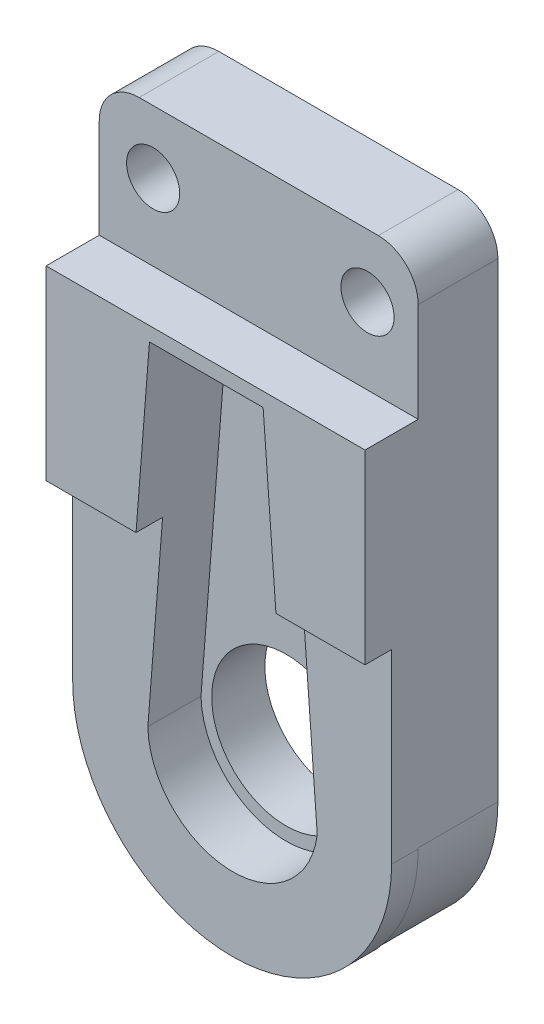
ISO-10303-21;
HEADER;
FILE_DESCRIPTION(('STEP AP214'),'2;1');
FILE_NAME('part.step','',(''),(''),'','','');
FILE_SCHEMA(('AUTOMOTIVE_DESIGN { 1 0 10303 214 1 1 1 1 }'));
ENDSEC;
DATA;
#1=APPLICATION_CONTEXT('core data for automotive mechanical design processes');
#2=APPLICATION_PROTOCOL_DEFINITION('international standard','automotive_design',2000,#1);
#3=PRODUCT_CONTEXT('',#1,'mechanical');
#4=PRODUCT('Part','Part','',(#3));
#5=PRODUCT_RELATED_PRODUCT_CATEGORY('part','',(#4));
#6=PRODUCT_DEFINITION_FORMATION('','',#4);
#7=PRODUCT_DEFINITION_CONTEXT('part definition',#1,'design');
#8=PRODUCT_DEFINITION('design','',#6,#7);
#9=PRODUCT_DEFINITION_SHAPE('','',#8);
#10=(LENGTH_UNIT() NAMED_UNIT(*) SI_UNIT(.MILLI.,.METRE.));
#11=(NAMED_UNIT(*) PLANE_ANGLE_UNIT() SI_UNIT($,.RADIAN.));
#12=(NAMED_UNIT(*) SI_UNIT($,.STERADIAN.) SOLID_ANGLE_UNIT());
#13=UNCERTAINTY_MEASURE_WITH_UNIT(LENGTH_MEASURE(1.E-05),#10,'distance_accuracy_value','');
#14=(GEOMETRIC_REPRESENTATION_CONTEXT(3) GLOBAL_UNCERTAINTY_ASSIGNED_CONTEXT((#13)) GLOBAL_UNIT_ASSIGNED_CONTEXT((#10,
#11,#12)) REPRESENTATION_CONTEXT('',''));
#15=CARTESIAN_POINT('',(0.,0.,0.));
#16=DIRECTION('',(0.,0.,1.));
#17=DIRECTION('',(1.,0.,0.));
#18=AXIS2_PLACEMENT_3D('',#15,#16,#17);
#19=CARTESIAN_POINT('',(-54.0277041312551,91.0179982473059,10.));
#20=DIRECTION('',(0.,0.,-1.));
#21=DIRECTION('',(-1.,0.,0.));
#22=AXIS2_PLACEMENT_3D('',#19,#20,#21);
#23=CYLINDRICAL_SURFACE('',#22,6.);
#24=DIRECTION('',(0.,0.,-1.));
#25=VECTOR('',#24,1.);
#26=CARTESIAN_POINT('',(-54.0277041312551,85.0179982473059,10.));
#27=LINE('',#26,#25);
#28=CARTESIAN_POINT('',(-54.0277041312551,85.0179982473059,9.));
#29=VERTEX_POINT('',#28);
#30=CARTESIAN_POINT('',(-54.0277041312551,85.0179982473059,8.));
#31=VERTEX_POINT('',#30);
#32=EDGE_CURVE('E281',#29,#31,#27,.T.);
#33=ORIENTED_EDGE('',*,*,#32,.F.);
#34=CARTESIAN_POINT('',(-54.0277041312551,91.0179982473059,9.));
#35=DIRECTION('',(0.,0.,1.));
#36=DIRECTION('',(1.,0.,0.));
#37=AXIS2_PLACEMENT_3D('',#34,#35,#36);
#38=CIRCLE('',#37,6.);
#39=CARTESIAN_POINT('',(-60.0277041312551,91.0179982473059,9.));
#40=VERTEX_POINT('',#39);
#41=EDGE_CURVE('E223',#29,#40,#38,.F.);
#42=ORIENTED_EDGE('',*,*,#41,.T.);
#43=DIRECTION('',(0.,0.,-1.));
#44=VECTOR('',#43,1.);
#45=CARTESIAN_POINT('',(-60.0277041312551,91.0179982473059,8.));
#46=LINE('',#45,#44);
#47=CARTESIAN_POINT('',(-60.0277041312551,91.0179982473059,8.));
#48=VERTEX_POINT('',#47);
#49=EDGE_CURVE('E207',#48,#40,#46,.F.);
#50=ORIENTED_EDGE('',*,*,#49,.F.);
#51=CARTESIAN_POINT('',(-54.0277041312551,91.0179982473059,8.));
#52=DIRECTION('',(0.,0.,1.));
#53=DIRECTION('',(1.,0.,0.));
#54=AXIS2_PLACEMENT_3D('',#51,#52,#53);
#55=CIRCLE('',#54,6.);
#56=EDGE_CURVE('E367',#31,#48,#55,.F.);
#57=ORIENTED_EDGE('',*,*,#56,.F.);
#58=EDGE_LOOP('',(#33,#42,#50,#57));
#59=FACE_BOUND('',#58,.T.);
#60=ADVANCED_FACE('F39',(#59),#23,.T.);
#61=CARTESIAN_POINT('',(-54.0277041312551,91.0179982473059,8.));
#62=DIRECTION('',(0.,0.,-1.));
#63=DIRECTION('',(-1.,0.,0.));
#64=AXIS2_PLACEMENT_3D('',#61,#62,#63);
#65=CYLINDRICAL_SURFACE('',#64,6.);
#66=DIRECTION('',(0.,0.,-1.));
#67=VECTOR('',#66,1.);
#68=CARTESIAN_POINT('',(-48.0277041312551,91.0179982473059,8.));
#69=LINE('',#68,#67);
#70=CARTESIAN_POINT('',(-48.0277041312551,91.0179982473059,9.));
#71=VERTEX_POINT('',#70);
#72=CARTESIAN_POINT('',(-48.0277041312551,91.0179982473059,8.));
#73=VERTEX_POINT('',#72);
#74=EDGE_CURVE('E361',#71,#73,#69,.T.);
#75=ORIENTED_EDGE('',*,*,#74,.F.);
#76=CARTESIAN_POINT('',(-54.0277041312551,91.0179982473059,9.));
#77=DIRECTION('',(0.,0.,1.));
#78=DIRECTION('',(1.,0.,0.));
#79=AXIS2_PLACEMENT_3D('',#76,#77,#78);
#80=CIRCLE('',#79,6.);
#81=EDGE_CURVE('E219',#71,#29,#80,.F.);
#82=ORIENTED_EDGE('',*,*,#81,.T.);
#83=ORIENTED_EDGE('',*,*,#32,.T.);
#84=CARTESIAN_POINT('',(-54.0277041312551,91.0179982473059,8.));
#85=DIRECTION('',(0.,0.,1.));
#86=DIRECTION('',(1.,0.,0.));
#87=AXIS2_PLACEMENT_3D('',#84,#85,#86);
#88=CIRCLE('',#87,6.);
#89=EDGE_CURVE('E370',#73,#31,#88,.F.);
#90=ORIENTED_EDGE('',*,*,#89,.F.);
#91=EDGE_LOOP('',(#75,#82,#83,#90));
#92=FACE_BOUND('',#91,.T.);
#93=ADVANCED_FACE('F450',(#92),#65,.T.);
#94=CARTESIAN_POINT('',(-54.0000006238961,90.985353999353,7.));
#95=DIRECTION('',(0.,0.,1.));
#96=DIRECTION('',(1.,0.,0.));
#97=AXIS2_PLACEMENT_3D('',#94,#95,#96);
#98=CYLINDRICAL_SURFACE('',#97,3.19999938509519);
#99=CARTESIAN_POINT('',(-54.0000006238961,90.985353999353,9.));
#100=DIRECTION('',(0.,0.,1.));
#101=DIRECTION('',(1.,0.,0.));
#102=AXIS2_PLACEMENT_3D('',#99,#100,#101);
#103=CIRCLE('',#102,3.19999938509519);
#104=CARTESIAN_POINT('',(-50.8248977661133,90.5869598388672,9.));
#105=VERTEX_POINT('',#104);
#106=CARTESIAN_POINT('',(-57.1992263793945,90.9149932861328,9.));
#107=VERTEX_POINT('',#106);
#108=EDGE_CURVE('E388',#105,#107,#103,.F.);
#109=ORIENTED_EDGE('',*,*,#108,.F.);
#110=DIRECTION('',(0.,0.,1.));
#111=VECTOR('',#110,1.);
#112=CARTESIAN_POINT('',(-50.8248977661133,90.5869598388672,7.));
#113=LINE('',#112,#111);
#114=CARTESIAN_POINT('',(-50.8248977661133,90.5869598388672,7.));
#115=VERTEX_POINT('',#114);
#116=EDGE_CURVE('E286',#115,#105,#113,.T.);
#117=ORIENTED_EDGE('',*,*,#116,.F.);
#118=CARTESIAN_POINT('',(-54.0000006238961,90.985353999353,7.));
#119=DIRECTION('',(0.,0.,1.));
#120=DIRECTION('',(1.,0.,0.));
#121=AXIS2_PLACEMENT_3D('',#118,#119,#120);
#122=CIRCLE('',#121,3.19999938509519);
#123=CARTESIAN_POINT('',(-57.1992263793945,90.9149932861328,7.));
#124=VERTEX_POINT('',#123);
#125=EDGE_CURVE('E264',#124,#115,#122,.T.);
#126=ORIENTED_EDGE('',*,*,#125,.F.);
#127=DIRECTION('',(0.,0.,1.));
#128=VECTOR('',#127,1.);
#129=CARTESIAN_POINT('',(-57.1992263793945,90.9149932861328,7.));
#130=LINE('',#129,#128);
#131=EDGE_CURVE('E276',#124,#107,#130,.T.);
#132=ORIENTED_EDGE('',*,*,#131,.T.);
#133=EDGE_LOOP('',(#109,#117,#126,#132));
#134=FACE_BOUND('',#133,.T.);
#135=ADVANCED_FACE('F479',(#134),#98,.F.);
#136=CARTESIAN_POINT('',(-60.0277041312551,110.255662644268,8.));
#137=DIRECTION('',(1.,0.,0.));
#138=DIRECTION('',(0.,0.,-1.));
#139=AXIS2_PLACEMENT_3D('',#136,#137,#138);
#140=PLANE('',#139);
#141=DIRECTION('',(0.,-1.,0.));
#142=VECTOR('',#141,1.);
#143=CARTESIAN_POINT('',(-60.0277041312551,110.255662644268,8.));
#144=LINE('',#143,#142);
#145=CARTESIAN_POINT('',(-60.0277041312551,108.755662644268,8.));
#146=VERTEX_POINT('',#145);
#147=CARTESIAN_POINT('',(-60.0277041312551,105.017998247306,8.));
#148=VERTEX_POINT('',#147);
#149=EDGE_CURVE('E321',#146,#148,#144,.T.);
#150=ORIENTED_EDGE('',*,*,#149,.F.);
#151=DIRECTION('',(0.,0.,-1.));
#152=VECTOR('',#151,1.);
#153=CARTESIAN_POINT('',(-60.0277041312551,108.755662644268,8.));
#154=LINE('',#153,#152);
#155=CARTESIAN_POINT('',(-60.0277041312551,108.755662644268,5.));
#156=VERTEX_POINT('',#155);
#157=EDGE_CURVE('E395',#146,#156,#154,.T.);
#158=ORIENTED_EDGE('',*,*,#157,.T.);
#159=DIRECTION('',(0.,-1.,0.));
#160=VECTOR('',#159,1.);
#161=CARTESIAN_POINT('',(-60.0277041312551,110.255662644268,5.));
#162=LINE('',#161,#160);
#163=CARTESIAN_POINT('',(-60.0277041312551,91.0556626442678,5.));
#164=VERTEX_POINT('',#163);
#165=EDGE_CURVE('E332',#156,#164,#162,.T.);
#166=ORIENTED_EDGE('',*,*,#165,.T.);
#167=DIRECTION('',(0.,0.,-1.));
#168=VECTOR('',#167,1.);
#169=CARTESIAN_POINT('',(-60.0277041312551,91.0556626442678,8.));
#170=LINE('',#169,#168);
#171=CARTESIAN_POINT('',(-60.0277041312551,91.0556626442678,8.));
#172=VERTEX_POINT('',#171);
#173=EDGE_CURVE('E358',#164,#172,#170,.F.);
#174=ORIENTED_EDGE('',*,*,#173,.T.);
#175=DIRECTION('',(0.,-1.,0.));
#176=VECTOR('',#175,1.);
#177=CARTESIAN_POINT('',(-60.0277041312551,105.017998247306,8.));
#178=LINE('',#177,#176);
#179=EDGE_CURVE('E304',#172,#48,#178,.T.);
#180=ORIENTED_EDGE('',*,*,#179,.T.);
#181=ORIENTED_EDGE('',*,*,#49,.T.);
#182=DIRECTION('',(0.,-1.,0.));
#183=VECTOR('',#182,1.);
#184=CARTESIAN_POINT('',(-60.0277041312551,98.017998247306,9.));
#185=LINE('',#184,#183);
#186=CARTESIAN_POINT('',(-60.0277041312551,98.017998247306,9.));
#187=VERTEX_POINT('',#186);
#188=EDGE_CURVE('E182',#187,#40,#185,.T.);
#189=ORIENTED_EDGE('',*,*,#188,.F.);
#190=DIRECTION('',(0.,0.,1.));
#191=VECTOR('',#190,1.);
#192=CARTESIAN_POINT('',(-60.0277041312551,98.017998247306,9.));
#193=LINE('',#192,#191);
#194=CARTESIAN_POINT('',(-60.0277041312551,98.017998247306,10.));
#195=VERTEX_POINT('',#194);
#196=EDGE_CURVE('E192',#187,#195,#193,.T.);
#197=ORIENTED_EDGE('',*,*,#196,.T.);
#198=DIRECTION('',(0.,-1.,0.));
#199=VECTOR('',#198,1.);
#200=CARTESIAN_POINT('',(-60.0277041312551,105.017998247306,10.));
#201=LINE('',#200,#199);
#202=CARTESIAN_POINT('',(-60.0277041312551,105.017998247306,10.));
#203=VERTEX_POINT('',#202);
#204=EDGE_CURVE('E293',#203,#195,#201,.T.);
#205=ORIENTED_EDGE('',*,*,#204,.F.);
#206=DIRECTION('',(0.,0.,-1.));
#207=VECTOR('',#206,1.);
#208=CARTESIAN_POINT('',(-60.0277041312551,105.017998247306,10.));
#209=LINE('',#208,#207);
#210=EDGE_CURVE('E303',#203,#148,#209,.T.);
#211=ORIENTED_EDGE('',*,*,#210,.T.);
#212=EDGE_LOOP('',(#150,#158,#166,#174,#180,#181,#189,#197,#205,#211));
#213=FACE_BOUND('',#212,.T.);
#214=ADVANCED_FACE('F204',(#213),#140,.F.);
#215=CARTESIAN_POINT('',(-48.0277041312551,110.255662644268,8.));
#216=DIRECTION('',(-1.,0.,0.));
#217=DIRECTION('',(0.,0.,1.));
#218=AXIS2_PLACEMENT_3D('',#215,#216,#217);
#219=PLANE('',#218);
#220=DIRECTION('',(0.,1.,0.));
#221=VECTOR('',#220,1.);
#222=CARTESIAN_POINT('',(-48.0277041312551,110.255662644268,5.));
#223=LINE('',#222,#221);
#224=CARTESIAN_POINT('',(-48.0277041312551,91.0556626442678,5.));
#225=VERTEX_POINT('',#224);
#226=CARTESIAN_POINT('',(-48.0277041312551,108.755662644268,5.));
#227=VERTEX_POINT('',#226);
#228=EDGE_CURVE('E335',#225,#227,#223,.T.);
#229=ORIENTED_EDGE('',*,*,#228,.T.);
#230=DIRECTION('',(0.,0.,-1.));
#231=VECTOR('',#230,1.);
#232=CARTESIAN_POINT('',(-48.0277041312551,108.755662644268,8.));
#233=LINE('',#232,#231);
#234=CARTESIAN_POINT('',(-48.0277041312551,108.755662644268,8.));
#235=VERTEX_POINT('',#234);
#236=EDGE_CURVE('E11',#227,#235,#233,.F.);
#237=ORIENTED_EDGE('',*,*,#236,.T.);
#238=DIRECTION('',(0.,1.,0.));
#239=VECTOR('',#238,1.);
#240=CARTESIAN_POINT('',(-48.0277041312551,110.255662644268,8.));
#241=LINE('',#240,#239);
#242=CARTESIAN_POINT('',(-48.0277041312551,105.017998247306,8.));
#243=VERTEX_POINT('',#242);
#244=EDGE_CURVE('E324',#243,#235,#241,.T.);
#245=ORIENTED_EDGE('',*,*,#244,.F.);
#246=DIRECTION('',(0.,0.,-1.));
#247=VECTOR('',#246,1.);
#248=CARTESIAN_POINT('',(-48.0277041312551,105.017998247306,10.));
#249=LINE('',#248,#247);
#250=CARTESIAN_POINT('',(-48.0277041312551,105.017998247306,10.));
#251=VERTEX_POINT('',#250);
#252=EDGE_CURVE('E316',#251,#243,#249,.T.);
#253=ORIENTED_EDGE('',*,*,#252,.F.);
#254=DIRECTION('',(0.,1.,0.));
#255=VECTOR('',#254,1.);
#256=CARTESIAN_POINT('',(-48.0277041312551,105.017998247306,10.));
#257=LINE('',#256,#255);
#258=CARTESIAN_POINT('',(-48.0277041312551,98.017998247306,10.));
#259=VERTEX_POINT('',#258);
#260=EDGE_CURVE('E296',#259,#251,#257,.T.);
#261=ORIENTED_EDGE('',*,*,#260,.F.);
#262=DIRECTION('',(0.,0.,-1.));
#263=VECTOR('',#262,1.);
#264=CARTESIAN_POINT('',(-48.0277041312551,98.017998247306,8.));
#265=LINE('',#264,#263);
#266=CARTESIAN_POINT('',(-48.0277041312551,98.017998247306,9.));
#267=VERTEX_POINT('',#266);
#268=EDGE_CURVE('E232',#259,#267,#265,.T.);
#269=ORIENTED_EDGE('',*,*,#268,.T.);
#270=DIRECTION('',(0.,1.,0.));
#271=VECTOR('',#270,1.);
#272=CARTESIAN_POINT('',(-48.0277041312551,110.255662644268,9.));
#273=LINE('',#272,#271);
#274=EDGE_CURVE('E226',#71,#267,#273,.T.);
#275=ORIENTED_EDGE('',*,*,#274,.F.);
#276=ORIENTED_EDGE('',*,*,#74,.T.);
#277=DIRECTION('',(0.,1.,0.));
#278=VECTOR('',#277,1.);
#279=CARTESIAN_POINT('',(-48.0277041312551,105.017998247306,8.));
#280=LINE('',#279,#278);
#281=CARTESIAN_POINT('',(-48.0277041312551,91.0556626442678,8.));
#282=VERTEX_POINT('',#281);
#283=EDGE_CURVE('E307',#73,#282,#280,.T.);
#284=ORIENTED_EDGE('',*,*,#283,.T.);
#285=DIRECTION('',(0.,0.,-1.));
#286=VECTOR('',#285,1.);
#287=CARTESIAN_POINT('',(-48.0277041312551,91.0556626442678,8.));
#288=LINE('',#287,#286);
#289=EDGE_CURVE('E331',#282,#225,#288,.T.);
#290=ORIENTED_EDGE('',*,*,#289,.T.);
#291=EDGE_LOOP('',(#229,#237,#245,#253,#261,#269,#275,#276,#284,#290));
#292=FACE_BOUND('',#291,.T.);
#293=ADVANCED_FACE('F430',(#292),#219,.F.);
#294=CARTESIAN_POINT('',(-60.0277041312551,110.255662644268,8.));
#295=DIRECTION('',(0.,-1.,0.));
#296=DIRECTION('',(0.,0.,-1.));
#297=AXIS2_PLACEMENT_3D('',#294,#295,#296);
#298=PLANE('',#297);
#299=DIRECTION('',(-1.,0.,0.));
#300=VECTOR('',#299,1.);
#301=CARTESIAN_POINT('',(-60.0277041312551,110.255662644268,5.));
#302=LINE('',#301,#300);
#303=CARTESIAN_POINT('',(-49.5277041312551,110.255662644268,5.));
#304=VERTEX_POINT('',#303);
#305=CARTESIAN_POINT('',(-58.5277041312551,110.255662644268,5.));
#306=VERTEX_POINT('',#305);
#307=EDGE_CURVE('E325',#304,#306,#302,.T.);
#308=ORIENTED_EDGE('',*,*,#307,.T.);
#309=DIRECTION('',(0.,0.,-1.));
#310=VECTOR('',#309,1.);
#311=CARTESIAN_POINT('',(-58.5277041312551,110.255662644268,8.));
#312=LINE('',#311,#310);
#313=CARTESIAN_POINT('',(-58.5277041312551,110.255662644268,8.));
#314=VERTEX_POINT('',#313);
#315=EDGE_CURVE('E61',#306,#314,#312,.F.);
#316=ORIENTED_EDGE('',*,*,#315,.T.);
#317=DIRECTION('',(-1.,0.,0.));
#318=VECTOR('',#317,1.);
#319=CARTESIAN_POINT('',(-60.0277041312551,110.255662644268,8.));
#320=LINE('',#319,#318);
#321=CARTESIAN_POINT('',(-49.5277041312551,110.255662644268,8.));
#322=VERTEX_POINT('',#321);
#323=EDGE_CURVE('E328',#322,#314,#320,.T.);
#324=ORIENTED_EDGE('',*,*,#323,.F.);
#325=DIRECTION('',(0.,0.,-1.));
#326=VECTOR('',#325,1.);
#327=CARTESIAN_POINT('',(-49.5277041312551,110.255662644268,8.));
#328=LINE('',#327,#326);
#329=EDGE_CURVE('E405',#322,#304,#328,.T.);
#330=ORIENTED_EDGE('',*,*,#329,.T.);
#331=EDGE_LOOP('',(#308,#316,#324,#330));
#332=FACE_BOUND('',#331,.T.);
#333=ADVANCED_FACE('F425',(#332),#298,.F.);
#334=CARTESIAN_POINT('',(0.,0.,8.));
#335=DIRECTION('',(0.,0.,1.));
#336=DIRECTION('',(1.,0.,0.));
#337=AXIS2_PLACEMENT_3D('',#334,#335,#336);
#338=PLANE('',#337);
#339=CARTESIAN_POINT('',(-57.9998852467417,107.886757067728,8.));
#340=DIRECTION('',(0.,0.,1.));
#341=DIRECTION('',(1.,0.,0.));
#342=AXIS2_PLACEMENT_3D('',#339,#340,#341);
#343=CIRCLE('',#342,1.00000000000001);
#344=CARTESIAN_POINT('',(-56.9998852467417,107.886757067728,8.));
#345=VERTEX_POINT('',#344);
#346=EDGE_CURVE('E242',#345,#345,#343,.T.);
#347=ORIENTED_EDGE('',*,*,#346,.F.);
#348=EDGE_LOOP('',(#347));
#349=FACE_BOUND('',#348,.T.);
#350=CARTESIAN_POINT('',(-49.9341185232434,107.886757067728,8.));
#351=DIRECTION('',(0.,0.,1.));
#352=DIRECTION('',(1.,0.,0.));
#353=AXIS2_PLACEMENT_3D('',#350,#351,#352);
#354=CIRCLE('',#353,1.00000000000001);
#355=CARTESIAN_POINT('',(-48.9341185232434,107.886757067728,8.));
#356=VERTEX_POINT('',#355);
#357=EDGE_CURVE('E236',#356,#356,#354,.T.);
#358=ORIENTED_EDGE('',*,*,#357,.F.);
#359=EDGE_LOOP('',(#358));
#360=FACE_BOUND('',#359,.T.);
#361=ORIENTED_EDGE('',*,*,#323,.T.);
#362=CARTESIAN_POINT('',(-58.5277041312551,108.755662644268,8.));
#363=DIRECTION('',(0.,0.,1.));
#364=DIRECTION('',(1.,0.,0.));
#365=AXIS2_PLACEMENT_3D('',#362,#363,#364);
#366=CIRCLE('',#365,1.5);
#367=EDGE_CURVE('E48',#314,#146,#366,.T.);
#368=ORIENTED_EDGE('',*,*,#367,.T.);
#369=ORIENTED_EDGE('',*,*,#149,.T.);
#370=DIRECTION('',(-1.,0.,0.));
#371=VECTOR('',#370,1.);
#372=CARTESIAN_POINT('',(-60.0277041312551,105.017998247306,8.));
#373=LINE('',#372,#371);
#374=EDGE_CURVE('E297',#243,#148,#373,.T.);
#375=ORIENTED_EDGE('',*,*,#374,.F.);
#376=ORIENTED_EDGE('',*,*,#244,.T.);
#377=CARTESIAN_POINT('',(-49.5277041312551,108.755662644268,8.));
#378=DIRECTION('',(0.,0.,1.));
#379=DIRECTION('',(1.,0.,0.));
#380=AXIS2_PLACEMENT_3D('',#377,#378,#379);
#381=CIRCLE('',#380,1.5);
#382=EDGE_CURVE('E411',#235,#322,#381,.T.);
#383=ORIENTED_EDGE('',*,*,#382,.T.);
#384=EDGE_LOOP('',(#361,#368,#369,#375,#376,#383));
#385=FACE_BOUND('',#384,.T.);
#386=ADVANCED_FACE('F416',(#349,#360,#385),#338,.T.);
#387=CARTESIAN_POINT('',(0.,0.,5.));
#388=DIRECTION('',(0.,0.,1.));
#389=DIRECTION('',(1.,0.,0.));
#390=AXIS2_PLACEMENT_3D('',#387,#388,#389);
#391=PLANE('',#390);
#392=CARTESIAN_POINT('',(-57.9998852467417,107.886757067728,5.));
#393=DIRECTION('',(0.,0.,1.));
#394=DIRECTION('',(1.,0.,0.));
#395=AXIS2_PLACEMENT_3D('',#392,#393,#394);
#396=CIRCLE('',#395,1.00000000000001);
#397=CARTESIAN_POINT('',(-56.9998852467417,107.886757067728,5.));
#398=VERTEX_POINT('',#397);
#399=EDGE_CURVE('E237',#398,#398,#396,.T.);
#400=ORIENTED_EDGE('',*,*,#399,.T.);
#401=EDGE_LOOP('',(#400));
#402=FACE_BOUND('',#401,.T.);
#403=CARTESIAN_POINT('',(-49.9341185232434,107.886757067728,5.));
#404=DIRECTION('',(0.,0.,1.));
#405=DIRECTION('',(1.,0.,0.));
#406=AXIS2_PLACEMENT_3D('',#403,#404,#405);
#407=CIRCLE('',#406,1.00000000000001);
#408=CARTESIAN_POINT('',(-48.9341185232434,107.886757067728,5.));
#409=VERTEX_POINT('',#408);
#410=EDGE_CURVE('E246',#409,#409,#407,.T.);
#411=ORIENTED_EDGE('',*,*,#410,.T.);
#412=EDGE_LOOP('',(#411));
#413=FACE_BOUND('',#412,.T.);
#414=CARTESIAN_POINT('',(-53.9974483250001,91.0820319097262,5.));
#415=DIRECTION('',(0.,0.,1.));
#416=DIRECTION('',(1.,0.,0.));
#417=AXIS2_PLACEMENT_3D('',#414,#415,#416);
#418=CIRCLE('',#417,2.8);
#419=CARTESIAN_POINT('',(-51.1974483250001,91.0820319097262,5.));
#420=VERTEX_POINT('',#419);
#421=EDGE_CURVE('E253',#420,#420,#418,.T.);
#422=ORIENTED_EDGE('',*,*,#421,.T.);
#423=EDGE_LOOP('',(#422));
#424=FACE_BOUND('',#423,.T.);
#425=ORIENTED_EDGE('',*,*,#165,.F.);
#426=CARTESIAN_POINT('',(-58.5277041312551,108.755662644268,5.));
#427=DIRECTION('',(0.,0.,1.));
#428=DIRECTION('',(1.,0.,0.));
#429=AXIS2_PLACEMENT_3D('',#426,#427,#428);
#430=CIRCLE('',#429,1.5);
#431=EDGE_CURVE('E402',#156,#306,#430,.F.);
#432=ORIENTED_EDGE('',*,*,#431,.T.);
#433=ORIENTED_EDGE('',*,*,#307,.F.);
#434=CARTESIAN_POINT('',(-49.5277041312551,108.755662644268,5.));
#435=DIRECTION('',(0.,0.,1.));
#436=DIRECTION('',(1.,0.,0.));
#437=AXIS2_PLACEMENT_3D('',#434,#435,#436);
#438=CIRCLE('',#437,1.5);
#439=EDGE_CURVE('E399',#304,#227,#438,.F.);
#440=ORIENTED_EDGE('',*,*,#439,.T.);
#441=ORIENTED_EDGE('',*,*,#228,.F.);
#442=CARTESIAN_POINT('',(-54.0277041312551,91.0556626442678,5.));
#443=DIRECTION('',(0.,0.,1.));
#444=DIRECTION('',(1.,0.,0.));
#445=AXIS2_PLACEMENT_3D('',#442,#443,#444);
#446=CIRCLE('',#445,6.);
#447=CARTESIAN_POINT('',(-54.0277041312551,85.0556626442678,5.));
#448=VERTEX_POINT('',#447);
#449=EDGE_CURVE('E347',#225,#448,#446,.F.);
#450=ORIENTED_EDGE('',*,*,#449,.T.);
#451=CARTESIAN_POINT('',(-54.0277041312551,91.0556626442678,5.));
#452=DIRECTION('',(0.,0.,1.));
#453=DIRECTION('',(1.,0.,0.));
#454=AXIS2_PLACEMENT_3D('',#451,#452,#453);
#455=CIRCLE('',#454,6.);
#456=EDGE_CURVE('E343',#448,#164,#455,.F.);
#457=ORIENTED_EDGE('',*,*,#456,.T.);
#458=EDGE_LOOP('',(#425,#432,#433,#440,#441,#450,#457));
#459=FACE_BOUND('',#458,.T.);
#460=ADVANCED_FACE('F424',(#402,#413,#424,#459),#391,.F.);
#461=CARTESIAN_POINT('',(-54.0277041312551,91.0556626442678,8.));
#462=DIRECTION('',(0.,0.,-1.));
#463=DIRECTION('',(-1.,0.,0.));
#464=AXIS2_PLACEMENT_3D('',#461,#462,#463);
#465=CYLINDRICAL_SURFACE('',#464,6.);
#466=DIRECTION('',(0.,0.,-1.));
#467=VECTOR('',#466,1.);
#468=CARTESIAN_POINT('',(-54.0277041312551,85.0556626442678,8.));
#469=LINE('',#468,#467);
#470=CARTESIAN_POINT('',(-54.0277041312551,85.0556626442678,8.));
#471=VERTEX_POINT('',#470);
#472=EDGE_CURVE('E320',#471,#448,#469,.T.);
#473=ORIENTED_EDGE('',*,*,#472,.F.);
#474=CARTESIAN_POINT('',(-54.0277041312551,91.0556626442678,8.));
#475=DIRECTION('',(0.,0.,1.));
#476=DIRECTION('',(1.,0.,0.));
#477=AXIS2_PLACEMENT_3D('',#474,#475,#476);
#478=CIRCLE('',#477,6.);
#479=EDGE_CURVE('E350',#172,#471,#478,.T.);
#480=ORIENTED_EDGE('',*,*,#479,.F.);
#481=ORIENTED_EDGE('',*,*,#173,.F.);
#482=ORIENTED_EDGE('',*,*,#456,.F.);
#483=EDGE_LOOP('',(#473,#480,#481,#482));
#484=FACE_BOUND('',#483,.T.);
#485=ADVANCED_FACE('F442',(#484),#465,.T.);
#486=CARTESIAN_POINT('',(-54.0277041312551,91.0556626442678,8.));
#487=DIRECTION('',(0.,0.,-1.));
#488=DIRECTION('',(-1.,0.,0.));
#489=AXIS2_PLACEMENT_3D('',#486,#487,#488);
#490=CYLINDRICAL_SURFACE('',#489,6.);
#491=CARTESIAN_POINT('',(-54.0277041312551,91.0556626442678,8.));
#492=DIRECTION('',(0.,0.,1.));
#493=DIRECTION('',(1.,0.,0.));
#494=AXIS2_PLACEMENT_3D('',#491,#492,#493);
#495=CIRCLE('',#494,6.);
#496=EDGE_CURVE('E354',#471,#282,#495,.T.);
#497=ORIENTED_EDGE('',*,*,#496,.F.);
#498=ORIENTED_EDGE('',*,*,#472,.T.);
#499=ORIENTED_EDGE('',*,*,#449,.F.);
#500=ORIENTED_EDGE('',*,*,#289,.F.);
#501=EDGE_LOOP('',(#497,#498,#499,#500));
#502=FACE_BOUND('',#501,.T.);
#503=ADVANCED_FACE('F435',(#502),#490,.T.);
#504=CARTESIAN_POINT('',(0.,0.,8.));
#505=DIRECTION('',(0.,0.,1.));
#506=DIRECTION('',(1.,0.,0.));
#507=AXIS2_PLACEMENT_3D('',#504,#505,#506);
#508=PLANE('',#507);
#509=ORIENTED_EDGE('',*,*,#283,.F.);
#510=ORIENTED_EDGE('',*,*,#89,.T.);
#511=ORIENTED_EDGE('',*,*,#56,.T.);
#512=ORIENTED_EDGE('',*,*,#179,.F.);
#513=ORIENTED_EDGE('',*,*,#479,.T.);
#514=ORIENTED_EDGE('',*,*,#496,.T.);
#515=EDGE_LOOP('',(#509,#510,#511,#512,#513,#514));
#516=FACE_BOUND('',#515,.T.);
#517=ADVANCED_FACE('F437',(#516),#508,.F.);
#518=CARTESIAN_POINT('',(-60.0277041312551,105.017998247306,10.));
#519=DIRECTION('',(0.,-1.,0.));
#520=DIRECTION('',(0.,0.,-1.));
#521=AXIS2_PLACEMENT_3D('',#518,#519,#520);
#522=PLANE('',#521);
#523=ORIENTED_EDGE('',*,*,#374,.T.);
#524=ORIENTED_EDGE('',*,*,#210,.F.);
#525=DIRECTION('',(-1.,0.,0.));
#526=VECTOR('',#525,1.);
#527=CARTESIAN_POINT('',(-60.0277041312551,105.017998247306,10.));
#528=LINE('',#527,#526);
#529=EDGE_CURVE('E300',#251,#203,#528,.T.);
#530=ORIENTED_EDGE('',*,*,#529,.F.);
#531=ORIENTED_EDGE('',*,*,#252,.T.);
#532=EDGE_LOOP('',(#523,#524,#530,#531));
#533=FACE_BOUND('',#532,.T.);
#534=ADVANCED_FACE('F483',(#533),#522,.F.);
#535=CARTESIAN_POINT('',(0.,0.,10.));
#536=DIRECTION('',(0.,0.,1.));
#537=DIRECTION('',(1.,0.,0.));
#538=AXIS2_PLACEMENT_3D('',#535,#536,#537);
#539=PLANE('',#538);
#540=DIRECTION('',(-1.,0.,0.));
#541=VECTOR('',#540,1.);
#542=CARTESIAN_POINT('',(-60.0277041312551,98.017998247306,10.));
#543=LINE('',#542,#541);
#544=CARTESIAN_POINT('',(-51.3791512986109,98.017998247306,10.));
#545=VERTEX_POINT('',#544);
#546=EDGE_CURVE('E209',#259,#545,#543,.T.);
#547=ORIENTED_EDGE('',*,*,#546,.F.);
#548=ORIENTED_EDGE('',*,*,#260,.T.);
#549=ORIENTED_EDGE('',*,*,#529,.T.);
#550=ORIENTED_EDGE('',*,*,#204,.T.);
#551=CARTESIAN_POINT('',(-56.6440073729356,98.017998247306,10.));
#552=VERTEX_POINT('',#551);
#553=EDGE_CURVE('E195',#552,#195,#543,.T.);
#554=ORIENTED_EDGE('',*,*,#553,.F.);
#555=DIRECTION('',(-0.0779290647362784,-0.996958906309247,0.));
#556=VECTOR('',#555,1.);
#557=CARTESIAN_POINT('',(-63.9152334498447,4.99604781463508,10.));
#558=LINE('',#557,#556);
#559=CARTESIAN_POINT('',(-56.1384239196777,104.48600769043,10.));
#560=VERTEX_POINT('',#559);
#561=EDGE_CURVE('E384',#560,#552,#558,.T.);
#562=ORIENTED_EDGE('',*,*,#561,.F.);
#563=DIRECTION('',(-1.,0.,0.));
#564=VECTOR('',#563,1.);
#565=CARTESIAN_POINT('',(0.,104.48600769043,10.));
#566=LINE('',#565,#564);
#567=CARTESIAN_POINT('',(-51.8615760803223,104.48600769043,10.));
#568=VERTEX_POINT('',#567);
#569=EDGE_CURVE('E381',#568,#560,#566,.T.);
#570=ORIENTED_EDGE('',*,*,#569,.F.);
#571=DIRECTION('',(-0.0743796784784657,0.997229995251567,0.));
#572=VECTOR('',#571,1.);
#573=CARTESIAN_POINT('',(-43.824552196528,-3.26871044529521,10.));
#574=LINE('',#573,#572);
#575=EDGE_CURVE('E376',#545,#568,#574,.T.);
#576=ORIENTED_EDGE('',*,*,#575,.F.);
#577=EDGE_LOOP('',(#547,#548,#549,#550,#554,#562,#570,#576));
#578=FACE_BOUND('',#577,.T.);
#579=ADVANCED_FACE('F465',(#578),#539,.T.);
#580=CARTESIAN_POINT('',(-56.1384239196777,104.48600769043,7.));
#581=DIRECTION('',(-0.996958906309246,0.0779290647362784,0.));
#582=DIRECTION('',(-0.0779290647362784,-0.996958906309247,0.));
#583=AXIS2_PLACEMENT_3D('',#580,#581,#582);
#584=PLANE('',#583);
#585=ORIENTED_EDGE('',*,*,#561,.T.);
#586=DIRECTION('',(0.,0.,-1.));
#587=VECTOR('',#586,1.);
#588=CARTESIAN_POINT('',(-56.6440073729356,98.017998247306,7.));
#589=LINE('',#588,#587);
#590=CARTESIAN_POINT('',(-56.6440073729356,98.017998247306,9.));
#591=VERTEX_POINT('',#590);
#592=EDGE_CURVE('E229',#552,#591,#589,.T.);
#593=ORIENTED_EDGE('',*,*,#592,.T.);
#594=DIRECTION('',(0.0779290647362784,0.996958906309247,0.));
#595=VECTOR('',#594,1.);
#596=CARTESIAN_POINT('',(-56.1384239196777,104.48600769043,9.));
#597=LINE('',#596,#595);
#598=EDGE_CURVE('E185',#107,#591,#597,.T.);
#599=ORIENTED_EDGE('',*,*,#598,.F.);
#600=ORIENTED_EDGE('',*,*,#131,.F.);
#601=DIRECTION('',(-0.0779290647362784,-0.996958906309247,0.));
#602=VECTOR('',#601,1.);
#603=CARTESIAN_POINT('',(-56.1384239196777,104.48600769043,7.));
#604=LINE('',#603,#602);
#605=CARTESIAN_POINT('',(-56.1384239196777,104.48600769043,7.));
#606=VERTEX_POINT('',#605);
#607=EDGE_CURVE('E257',#606,#124,#604,.T.);
#608=ORIENTED_EDGE('',*,*,#607,.F.);
#609=DIRECTION('',(0.,0.,1.));
#610=VECTOR('',#609,1.);
#611=CARTESIAN_POINT('',(-56.1384239196777,104.48600769043,7.));
#612=LINE('',#611,#610);
#613=EDGE_CURVE('E277',#606,#560,#612,.T.);
#614=ORIENTED_EDGE('',*,*,#613,.T.);
#615=EDGE_LOOP('',(#585,#593,#599,#600,#608,#614));
#616=FACE_BOUND('',#615,.T.);
#617=ADVANCED_FACE('F472',(#616),#584,.F.);
#618=CARTESIAN_POINT('',(-56.1384239196777,104.48600769043,7.));
#619=DIRECTION('',(0.,1.,0.));
#620=DIRECTION('',(0.,0.,1.));
#621=AXIS2_PLACEMENT_3D('',#618,#619,#620);
#622=PLANE('',#621);
#623=ORIENTED_EDGE('',*,*,#569,.T.);
#624=ORIENTED_EDGE('',*,*,#613,.F.);
#625=DIRECTION('',(-1.,0.,0.));
#626=VECTOR('',#625,1.);
#627=CARTESIAN_POINT('',(-56.1384239196777,104.48600769043,7.));
#628=LINE('',#627,#626);
#629=CARTESIAN_POINT('',(-51.8615760803223,104.48600769043,7.));
#630=VERTEX_POINT('',#629);
#631=EDGE_CURVE('E272',#630,#606,#628,.T.);
#632=ORIENTED_EDGE('',*,*,#631,.F.);
#633=DIRECTION('',(0.,0.,1.));
#634=VECTOR('',#633,1.);
#635=CARTESIAN_POINT('',(-51.8615760803223,104.48600769043,7.));
#636=LINE('',#635,#634);
#637=EDGE_CURVE('E282',#630,#568,#636,.T.);
#638=ORIENTED_EDGE('',*,*,#637,.T.);
#639=EDGE_LOOP('',(#623,#624,#632,#638));
#640=FACE_BOUND('',#639,.T.);
#641=ADVANCED_FACE('F468',(#640),#622,.F.);
#642=CARTESIAN_POINT('',(-51.8615760803223,104.48600769043,7.));
#643=DIRECTION('',(0.997229995251567,0.0743796784784657,0.));
#644=DIRECTION('',(-0.0743796784784657,0.997229995251567,0.));
#645=AXIS2_PLACEMENT_3D('',#642,#643,#644);
#646=PLANE('',#645);
#647=DIRECTION('',(0.0743796784784657,-0.997229995251567,0.));
#648=VECTOR('',#647,1.);
#649=CARTESIAN_POINT('',(-51.8615760803223,104.48600769043,9.));
#650=LINE('',#649,#648);
#651=CARTESIAN_POINT('',(-51.3791512986109,98.017998247306,9.));
#652=VERTEX_POINT('',#651);
#653=EDGE_CURVE('E200',#652,#105,#650,.T.);
#654=ORIENTED_EDGE('',*,*,#653,.F.);
#655=DIRECTION('',(0.,0.,1.));
#656=VECTOR('',#655,1.);
#657=CARTESIAN_POINT('',(-51.3791512986109,98.017998247306,7.));
#658=LINE('',#657,#656);
#659=EDGE_CURVE('E391',#652,#545,#658,.T.);
#660=ORIENTED_EDGE('',*,*,#659,.T.);
#661=ORIENTED_EDGE('',*,*,#575,.T.);
#662=ORIENTED_EDGE('',*,*,#637,.F.);
#663=DIRECTION('',(-0.0743796784784657,0.997229995251567,0.));
#664=VECTOR('',#663,1.);
#665=CARTESIAN_POINT('',(-51.8615760803223,104.48600769043,7.));
#666=LINE('',#665,#664);
#667=EDGE_CURVE('E268',#115,#630,#666,.T.);
#668=ORIENTED_EDGE('',*,*,#667,.F.);
#669=ORIENTED_EDGE('',*,*,#116,.T.);
#670=EDGE_LOOP('',(#654,#660,#661,#662,#668,#669));
#671=FACE_BOUND('',#670,.T.);
#672=ADVANCED_FACE('F462',(#671),#646,.F.);
#673=CARTESIAN_POINT('',(-54.0000006238961,90.985353999353,7.));
#674=DIRECTION('',(0.,0.,1.));
#675=DIRECTION('',(1.,0.,0.));
#676=AXIS2_PLACEMENT_3D('',#673,#674,#675);
#677=PLANE('',#676);
#678=CARTESIAN_POINT('',(-53.9974483250001,91.0820319097262,7.));
#679=DIRECTION('',(0.,0.,1.));
#680=DIRECTION('',(1.,0.,0.));
#681=AXIS2_PLACEMENT_3D('',#678,#679,#680);
#682=CIRCLE('',#681,2.8);
#683=CARTESIAN_POINT('',(-51.1974483250001,91.0820319097262,7.));
#684=VERTEX_POINT('',#683);
#685=EDGE_CURVE('E241',#684,#684,#682,.T.);
#686=ORIENTED_EDGE('',*,*,#685,.F.);
#687=EDGE_LOOP('',(#686));
#688=FACE_BOUND('',#687,.T.);
#689=ORIENTED_EDGE('',*,*,#607,.T.);
#690=ORIENTED_EDGE('',*,*,#125,.T.);
#691=ORIENTED_EDGE('',*,*,#667,.T.);
#692=ORIENTED_EDGE('',*,*,#631,.T.);
#693=EDGE_LOOP('',(#689,#690,#691,#692));
#694=FACE_BOUND('',#693,.T.);
#695=ADVANCED_FACE('F475',(#688,#694),#677,.T.);
#696=CARTESIAN_POINT('',(-53.9974483250001,91.0820319097262,5.));
#697=DIRECTION('',(0.,0.,1.));
#698=DIRECTION('',(1.,0.,0.));
#699=AXIS2_PLACEMENT_3D('',#696,#697,#698);
#700=CYLINDRICAL_SURFACE('',#699,2.8);
#701=ORIENTED_EDGE('',*,*,#421,.F.);
#702=EDGE_LOOP('',(#701));
#703=FACE_BOUND('',#702,.T.);
#704=ORIENTED_EDGE('',*,*,#685,.T.);
#705=EDGE_LOOP('',(#704));
#706=FACE_BOUND('',#705,.T.);
#707=ADVANCED_FACE('F519',(#703,#706),#700,.F.);
#708=CARTESIAN_POINT('',(-49.9341185232434,107.886757067728,5.));
#709=DIRECTION('',(0.,0.,1.));
#710=DIRECTION('',(1.,0.,0.));
#711=AXIS2_PLACEMENT_3D('',#708,#709,#710);
#712=CYLINDRICAL_SURFACE('',#711,1.00000000000001);
#713=ORIENTED_EDGE('',*,*,#410,.F.);
#714=EDGE_LOOP('',(#713));
#715=FACE_BOUND('',#714,.T.);
#716=ORIENTED_EDGE('',*,*,#357,.T.);
#717=EDGE_LOOP('',(#716));
#718=FACE_BOUND('',#717,.T.);
#719=ADVANCED_FACE('F515',(#715,#718),#712,.F.);
#720=CARTESIAN_POINT('',(-57.9998852467417,107.886757067728,5.));
#721=DIRECTION('',(0.,0.,1.));
#722=DIRECTION('',(1.,0.,0.));
#723=AXIS2_PLACEMENT_3D('',#720,#721,#722);
#724=CYLINDRICAL_SURFACE('',#723,1.00000000000001);
#725=ORIENTED_EDGE('',*,*,#399,.F.);
#726=EDGE_LOOP('',(#725));
#727=FACE_BOUND('',#726,.T.);
#728=ORIENTED_EDGE('',*,*,#346,.T.);
#729=EDGE_LOOP('',(#728));
#730=FACE_BOUND('',#729,.T.);
#731=ADVANCED_FACE('F512',(#727,#730),#724,.F.);
#732=CARTESIAN_POINT('',(-60.0277041312551,98.017998247306,9.));
#733=DIRECTION('',(0.,1.,0.));
#734=DIRECTION('',(0.,0.,1.));
#735=AXIS2_PLACEMENT_3D('',#732,#733,#734);
#736=PLANE('',#735);
#737=ORIENTED_EDGE('',*,*,#546,.T.);
#738=ORIENTED_EDGE('',*,*,#659,.F.);
#739=DIRECTION('',(-1.,0.,0.));
#740=VECTOR('',#739,1.);
#741=CARTESIAN_POINT('',(-60.0277041312551,98.017998247306,9.));
#742=LINE('',#741,#740);
#743=EDGE_CURVE('E189',#267,#652,#742,.T.);
#744=ORIENTED_EDGE('',*,*,#743,.F.);
#745=ORIENTED_EDGE('',*,*,#268,.F.);
#746=EDGE_LOOP('',(#737,#738,#744,#745));
#747=FACE_BOUND('',#746,.T.);
#748=ADVANCED_FACE('F457',(#747),#736,.F.);
#749=ORIENTED_EDGE('',*,*,#553,.T.);
#750=ORIENTED_EDGE('',*,*,#196,.F.);
#751=EDGE_CURVE('E178',#591,#187,#742,.T.);
#752=ORIENTED_EDGE('',*,*,#751,.F.);
#753=ORIENTED_EDGE('',*,*,#592,.F.);
#754=EDGE_LOOP('',(#749,#750,#752,#753));
#755=FACE_BOUND('',#754,.T.);
#756=ADVANCED_FACE('F193',(#755),#736,.F.);
#757=CARTESIAN_POINT('',(0.,0.,9.));
#758=DIRECTION('',(0.,0.,1.));
#759=DIRECTION('',(1.,0.,0.));
#760=AXIS2_PLACEMENT_3D('',#757,#758,#759);
#761=PLANE('',#760);
#762=ORIENTED_EDGE('',*,*,#274,.T.);
#763=ORIENTED_EDGE('',*,*,#743,.T.);
#764=ORIENTED_EDGE('',*,*,#653,.T.);
#765=ORIENTED_EDGE('',*,*,#108,.T.);
#766=ORIENTED_EDGE('',*,*,#598,.T.);
#767=ORIENTED_EDGE('',*,*,#751,.T.);
#768=ORIENTED_EDGE('',*,*,#188,.T.);
#769=ORIENTED_EDGE('',*,*,#41,.F.);
#770=ORIENTED_EDGE('',*,*,#81,.F.);
#771=EDGE_LOOP('',(#762,#763,#764,#765,#766,#767,#768,#769,#770));
#772=FACE_BOUND('',#771,.T.);
#773=ADVANCED_FACE('F180',(#772),#761,.T.);
#774=CARTESIAN_POINT('',(-58.5277041312551,108.755662644268,8.));
#775=DIRECTION('',(0.,0.,-1.));
#776=DIRECTION('',(-1.,0.,0.));
#777=AXIS2_PLACEMENT_3D('',#774,#775,#776);
#778=CYLINDRICAL_SURFACE('',#777,1.5);
#779=ORIENTED_EDGE('',*,*,#367,.F.);
#780=ORIENTED_EDGE('',*,*,#315,.F.);
#781=ORIENTED_EDGE('',*,*,#431,.F.);
#782=ORIENTED_EDGE('',*,*,#157,.F.);
#783=EDGE_LOOP('',(#779,#780,#781,#782));
#784=FACE_BOUND('',#783,.T.);
#785=ADVANCED_FACE('F421',(#784),#778,.T.);
#786=CARTESIAN_POINT('',(-49.5277041312551,108.755662644268,8.));
#787=DIRECTION('',(0.,0.,-1.));
#788=DIRECTION('',(-1.,0.,0.));
#789=AXIS2_PLACEMENT_3D('',#786,#787,#788);
#790=CYLINDRICAL_SURFACE('',#789,1.5);
#791=ORIENTED_EDGE('',*,*,#382,.F.);
#792=ORIENTED_EDGE('',*,*,#236,.F.);
#793=ORIENTED_EDGE('',*,*,#439,.F.);
#794=ORIENTED_EDGE('',*,*,#329,.F.);
#795=EDGE_LOOP('',(#791,#792,#793,#794));
#796=FACE_BOUND('',#795,.T.);
#797=ADVANCED_FACE('F41',(#796),#790,.T.);
#798=CLOSED_SHELL('',(#60,#93,#135,#214,#293,#333,#386,#460,#485,#503,#517,#534,#579,#617,#641,
#672,#695,#707,#719,#731,#748,#756,#773,#785,#797));
#799=MANIFOLD_SOLID_BREP('B2',#798);
#800=ADVANCED_BREP_SHAPE_REPRESENTATION('',(#18,#799),#14);
#801=SHAPE_DEFINITION_REPRESENTATION(#9,#800);
ENDSEC;
END-ISO-10303-21;
